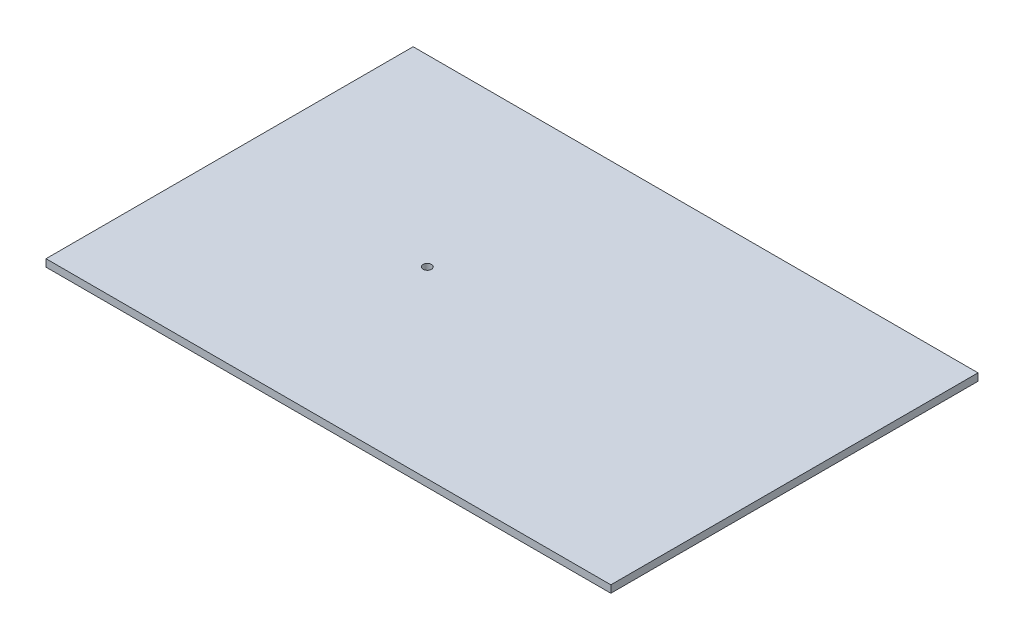
ISO-10303-21;
HEADER;
FILE_DESCRIPTION(('STEP AP214'),'2;1');
FILE_NAME('part.step','',(''),(''),'','','');
FILE_SCHEMA(('AUTOMOTIVE_DESIGN { 1 0 10303 214 1 1 1 1 }'));
ENDSEC;
DATA;
#1=APPLICATION_CONTEXT('core data for automotive mechanical design processes');
#2=APPLICATION_PROTOCOL_DEFINITION('international standard','automotive_design',2000,#1);
#3=PRODUCT_CONTEXT('',#1,'mechanical');
#4=PRODUCT('Part','Part','',(#3));
#5=PRODUCT_RELATED_PRODUCT_CATEGORY('part','',(#4));
#6=PRODUCT_DEFINITION_FORMATION('','',#4);
#7=PRODUCT_DEFINITION_CONTEXT('part definition',#1,'design');
#8=PRODUCT_DEFINITION('design','',#6,#7);
#9=PRODUCT_DEFINITION_SHAPE('','',#8);
#10=(LENGTH_UNIT() NAMED_UNIT(*) SI_UNIT(.MILLI.,.METRE.));
#11=(NAMED_UNIT(*) PLANE_ANGLE_UNIT() SI_UNIT($,.RADIAN.));
#12=(NAMED_UNIT(*) SI_UNIT($,.STERADIAN.) SOLID_ANGLE_UNIT());
#13=UNCERTAINTY_MEASURE_WITH_UNIT(LENGTH_MEASURE(1.E-05),#10,'distance_accuracy_value','');
#14=(GEOMETRIC_REPRESENTATION_CONTEXT(3) GLOBAL_UNCERTAINTY_ASSIGNED_CONTEXT((#13)) GLOBAL_UNIT_ASSIGNED_CONTEXT((#10,
#11,#12)) REPRESENTATION_CONTEXT('',''));
#15=CARTESIAN_POINT('',(0.,0.,0.));
#16=DIRECTION('',(0.,0.,1.));
#17=DIRECTION('',(1.,0.,0.));
#18=AXIS2_PLACEMENT_3D('',#15,#16,#17);
#19=CARTESIAN_POINT('',(0.,3.302,-82.55));
#20=DIRECTION('',(0.,0.,-1.));
#21=DIRECTION('',(-1.,0.,0.));
#22=AXIS2_PLACEMENT_3D('',#19,#20,#21);
#23=PLANE('',#22);
#24=DIRECTION('',(1.,0.,0.));
#25=VECTOR('',#24,1.);
#26=CARTESIAN_POINT('',(0.,0.,-82.55));
#27=LINE('',#26,#25);
#28=CARTESIAN_POINT('',(-127.,0.,-82.55));
#29=VERTEX_POINT('',#28);
#30=CARTESIAN_POINT('',(127.,0.,-82.55));
#31=VERTEX_POINT('',#30);
#32=EDGE_CURVE('E125',#29,#31,#27,.T.);
#33=ORIENTED_EDGE('',*,*,#32,.F.);
#34=DIRECTION('',(0.,-1.,0.));
#35=VECTOR('',#34,1.);
#36=CARTESIAN_POINT('',(-127.,3.302,-82.55));
#37=LINE('',#36,#35);
#38=CARTESIAN_POINT('',(-127.,3.302,-82.55));
#39=VERTEX_POINT('',#38);
#40=EDGE_CURVE('E11',#39,#29,#37,.T.);
#41=ORIENTED_EDGE('',*,*,#40,.F.);
#42=DIRECTION('',(1.,0.,0.));
#43=VECTOR('',#42,1.);
#44=CARTESIAN_POINT('',(0.,3.302,-82.55));
#45=LINE('',#44,#43);
#46=CARTESIAN_POINT('',(127.,3.302,-82.55));
#47=VERTEX_POINT('',#46);
#48=EDGE_CURVE('E111',#39,#47,#45,.T.);
#49=ORIENTED_EDGE('',*,*,#48,.T.);
#50=DIRECTION('',(0.,-1.,0.));
#51=VECTOR('',#50,1.);
#52=CARTESIAN_POINT('',(127.,3.302,-82.55));
#53=LINE('',#52,#51);
#54=EDGE_CURVE('E88',#47,#31,#53,.T.);
#55=ORIENTED_EDGE('',*,*,#54,.T.);
#56=EDGE_LOOP('',(#33,#41,#49,#55));
#57=FACE_BOUND('',#56,.T.);
#58=ADVANCED_FACE('F47',(#57),#23,.T.);
#59=CARTESIAN_POINT('',(-127.,3.302,0.));
#60=DIRECTION('',(-1.,0.,0.));
#61=DIRECTION('',(0.,0.,1.));
#62=AXIS2_PLACEMENT_3D('',#59,#60,#61);
#63=PLANE('',#62);
#64=DIRECTION('',(0.,0.,-1.));
#65=VECTOR('',#64,1.);
#66=CARTESIAN_POINT('',(-127.,0.,0.));
#67=LINE('',#66,#65);
#68=CARTESIAN_POINT('',(-127.,0.,82.55));
#69=VERTEX_POINT('',#68);
#70=EDGE_CURVE('E100',#69,#29,#67,.T.);
#71=ORIENTED_EDGE('',*,*,#70,.F.);
#72=DIRECTION('',(0.,-1.,0.));
#73=VECTOR('',#72,1.);
#74=CARTESIAN_POINT('',(-127.,3.302,82.55));
#75=LINE('',#74,#73);
#76=CARTESIAN_POINT('',(-127.,3.302,82.55));
#77=VERTEX_POINT('',#76);
#78=EDGE_CURVE('E57',#77,#69,#75,.T.);
#79=ORIENTED_EDGE('',*,*,#78,.F.);
#80=DIRECTION('',(0.,0.,-1.));
#81=VECTOR('',#80,1.);
#82=CARTESIAN_POINT('',(-127.,3.302,0.));
#83=LINE('',#82,#81);
#84=EDGE_CURVE('E98',#77,#39,#83,.T.);
#85=ORIENTED_EDGE('',*,*,#84,.T.);
#86=ORIENTED_EDGE('',*,*,#40,.T.);
#87=EDGE_LOOP('',(#71,#79,#85,#86));
#88=FACE_BOUND('',#87,.T.);
#89=ADVANCED_FACE('F96',(#88),#63,.T.);
#90=CARTESIAN_POINT('',(0.,3.302,82.55));
#91=DIRECTION('',(0.,0.,-1.));
#92=DIRECTION('',(-1.,0.,0.));
#93=AXIS2_PLACEMENT_3D('',#90,#91,#92);
#94=PLANE('',#93);
#95=DIRECTION('',(1.,0.,0.));
#96=VECTOR('',#95,1.);
#97=CARTESIAN_POINT('',(0.,0.,82.55));
#98=LINE('',#97,#96);
#99=CARTESIAN_POINT('',(127.,0.,82.55));
#100=VERTEX_POINT('',#99);
#101=EDGE_CURVE('E130',#69,#100,#98,.T.);
#102=ORIENTED_EDGE('',*,*,#101,.T.);
#103=DIRECTION('',(0.,-1.,0.));
#104=VECTOR('',#103,1.);
#105=CARTESIAN_POINT('',(127.,3.302,82.55));
#106=LINE('',#105,#104);
#107=CARTESIAN_POINT('',(127.,3.302,82.55));
#108=VERTEX_POINT('',#107);
#109=EDGE_CURVE('E104',#108,#100,#106,.T.);
#110=ORIENTED_EDGE('',*,*,#109,.F.);
#111=DIRECTION('',(1.,0.,0.));
#112=VECTOR('',#111,1.);
#113=CARTESIAN_POINT('',(0.,3.302,82.55));
#114=LINE('',#113,#112);
#115=EDGE_CURVE('E106',#77,#108,#114,.T.);
#116=ORIENTED_EDGE('',*,*,#115,.F.);
#117=ORIENTED_EDGE('',*,*,#78,.T.);
#118=EDGE_LOOP('',(#102,#110,#116,#117));
#119=FACE_BOUND('',#118,.T.);
#120=ADVANCED_FACE('F107',(#119),#94,.F.);
#121=CARTESIAN_POINT('',(-38.1,3.302,0.));
#122=DIRECTION('',(0.,-1.,0.));
#123=DIRECTION('',(0.,0.,-1.));
#124=AXIS2_PLACEMENT_3D('',#121,#122,#123);
#125=CYLINDRICAL_SURFACE('',#124,1.905);
#126=CARTESIAN_POINT('',(-38.1,3.302,0.));
#127=DIRECTION('',(0.,1.,0.));
#128=DIRECTION('',(0.,0.,1.));
#129=AXIS2_PLACEMENT_3D('',#126,#127,#128);
#130=CIRCLE('',#129,1.905);
#131=CARTESIAN_POINT('',(-38.1,3.302,-1.90499999999999));
#132=VERTEX_POINT('',#131);
#133=EDGE_CURVE('E115',#132,#132,#130,.T.);
#134=CARTESIAN_POINT('',(-38.1,0.,0.));
#135=DIRECTION('',(0.,1.,0.));
#136=DIRECTION('',(0.,0.,1.));
#137=AXIS2_PLACEMENT_3D('',#134,#135,#136);
#138=CIRCLE('',#137,1.905);
#139=CARTESIAN_POINT('',(-38.1,0.,-1.90499999999999));
#140=VERTEX_POINT('',#139);
#141=EDGE_CURVE('E121',#140,#140,#138,.T.);
#142=CARTESIAN_POINT('',(-38.1,3.302,-1.90499999999999));
#143=CARTESIAN_POINT('',(-38.1,3.26760416666667,-1.90499999999999));
#144=CARTESIAN_POINT('',(-38.1,3.23320833333333,-1.90499999999999));
#145=CARTESIAN_POINT('',(-38.1,3.16441666666667,-1.90499999999999));
#146=CARTESIAN_POINT('',(-38.1,3.13002083333333,-1.90499999999999));
#147=CARTESIAN_POINT('',(-38.1,3.06122916666667,-1.90499999999999));
#148=CARTESIAN_POINT('',(-38.1,3.02683333333333,-1.90499999999999));
#149=CARTESIAN_POINT('',(-38.1,2.95804166666667,-1.90499999999999));
#150=CARTESIAN_POINT('',(-38.1,2.92364583333333,-1.90499999999999));
#151=CARTESIAN_POINT('',(-38.1,2.85485416666667,-1.90499999999999));
#152=CARTESIAN_POINT('',(-38.1,2.82045833333333,-1.90499999999999));
#153=CARTESIAN_POINT('',(-38.1,2.75166666666667,-1.90499999999999));
#154=CARTESIAN_POINT('',(-38.1,2.71727083333333,-1.90499999999999));
#155=CARTESIAN_POINT('',(-38.1,2.64847916666667,-1.90499999999999));
#156=CARTESIAN_POINT('',(-38.1,2.61408333333333,-1.90499999999999));
#157=CARTESIAN_POINT('',(-38.1,2.54529166666667,-1.90499999999999));
#158=CARTESIAN_POINT('',(-38.1,2.51089583333333,-1.90499999999999));
#159=CARTESIAN_POINT('',(-38.1,2.44210416666667,-1.90499999999999));
#160=CARTESIAN_POINT('',(-38.1,2.40770833333333,-1.90499999999999));
#161=CARTESIAN_POINT('',(-38.1,2.33891666666667,-1.90499999999999));
#162=CARTESIAN_POINT('',(-38.1,2.30452083333333,-1.90499999999999));
#163=CARTESIAN_POINT('',(-38.1,2.23572916666667,-1.90499999999999));
#164=CARTESIAN_POINT('',(-38.1,2.20133333333333,-1.90499999999999));
#165=CARTESIAN_POINT('',(-38.1,2.13254166666667,-1.90499999999999));
#166=CARTESIAN_POINT('',(-38.1,2.09814583333333,-1.90499999999999));
#167=CARTESIAN_POINT('',(-38.1,2.02935416666667,-1.90499999999999));
#168=CARTESIAN_POINT('',(-38.1,1.99495833333333,-1.90499999999999));
#169=CARTESIAN_POINT('',(-38.1,1.92616666666667,-1.90499999999999));
#170=CARTESIAN_POINT('',(-38.1,1.89177083333333,-1.90499999999999));
#171=CARTESIAN_POINT('',(-38.1,1.82297916666667,-1.90499999999999));
#172=CARTESIAN_POINT('',(-38.1,1.78858333333333,-1.90499999999999));
#173=CARTESIAN_POINT('',(-38.1,1.71979166666667,-1.90499999999999));
#174=CARTESIAN_POINT('',(-38.1,1.68539583333333,-1.90499999999999));
#175=CARTESIAN_POINT('',(-38.1,1.61660416666667,-1.90499999999999));
#176=CARTESIAN_POINT('',(-38.1,1.58220833333333,-1.90499999999999));
#177=CARTESIAN_POINT('',(-38.1,1.51341666666667,-1.90499999999999));
#178=CARTESIAN_POINT('',(-38.1,1.47902083333333,-1.90499999999999));
#179=CARTESIAN_POINT('',(-38.1,1.41022916666667,-1.90499999999999));
#180=CARTESIAN_POINT('',(-38.1,1.37583333333333,-1.90499999999999));
#181=CARTESIAN_POINT('',(-38.1,1.30704166666667,-1.90499999999999));
#182=CARTESIAN_POINT('',(-38.1,1.27264583333333,-1.90499999999999));
#183=CARTESIAN_POINT('',(-38.1,1.20385416666667,-1.90499999999999));
#184=CARTESIAN_POINT('',(-38.1,1.16945833333333,-1.90499999999999));
#185=CARTESIAN_POINT('',(-38.1,1.10066666666667,-1.90499999999999));
#186=CARTESIAN_POINT('',(-38.1,1.06627083333333,-1.90499999999999));
#187=CARTESIAN_POINT('',(-38.1,0.997479166666666,-1.90499999999999));
#188=CARTESIAN_POINT('',(-38.1,0.963083333333333,-1.90499999999999));
#189=CARTESIAN_POINT('',(-38.1,0.894291666666666,-1.90499999999999));
#190=CARTESIAN_POINT('',(-38.1,0.859895833333333,-1.90499999999999));
#191=CARTESIAN_POINT('',(-38.1,0.791104166666666,-1.90499999999999));
#192=CARTESIAN_POINT('',(-38.1,0.756708333333333,-1.90499999999999));
#193=CARTESIAN_POINT('',(-38.1,0.687916666666667,-1.90499999999999));
#194=CARTESIAN_POINT('',(-38.1,0.653520833333333,-1.90499999999999));
#195=CARTESIAN_POINT('',(-38.1,0.584729166666667,-1.90499999999999));
#196=CARTESIAN_POINT('',(-38.1,0.550333333333333,-1.90499999999999));
#197=CARTESIAN_POINT('',(-38.1,0.481541666666667,-1.90499999999999));
#198=CARTESIAN_POINT('',(-38.1,0.447145833333333,-1.90499999999999));
#199=CARTESIAN_POINT('',(-38.1,0.378354166666667,-1.90499999999999));
#200=CARTESIAN_POINT('',(-38.1,0.343958333333333,-1.90499999999999));
#201=CARTESIAN_POINT('',(-38.1,0.275166666666667,-1.90499999999999));
#202=CARTESIAN_POINT('',(-38.1,0.240770833333333,-1.90499999999999));
#203=CARTESIAN_POINT('',(-38.1,0.171979166666667,-1.90499999999999));
#204=CARTESIAN_POINT('',(-38.1,0.137583333333333,-1.90499999999999));
#205=CARTESIAN_POINT('',(-38.1,0.0687916666666666,-1.90499999999999));
#206=CARTESIAN_POINT('',(-38.1,0.0343958333333333,-1.90499999999999));
#207=CARTESIAN_POINT('',(-38.1,0.,-1.90499999999999));
#208=B_SPLINE_CURVE_WITH_KNOTS('',3,(#142,#143,#144,#145,#146,#147,#148,#149,#150,#151,#152,
#153,#154,#155,#156,#157,#158,#159,#160,#161,#162,#163,#164,#165,#166,#167,#168,#169,#170,#171,
#172,#173,#174,#175,#176,#177,#178,#179,#180,#181,#182,#183,#184,#185,#186,#187,#188,#189,#190,
#191,#192,#193,#194,#195,#196,#197,#198,#199,#200,#201,#202,#203,#204,#205,#206,#207),
.UNSPECIFIED.,.F.,.F.,(4,2,2,2,2,2,2,2,2,2,2,2,2,2,2,2,2,2,2,2,2,2,2,2,2,2,2,2,2,2,2,2,4),(0.,
0.1031875,0.206375,0.3095625,0.41275,0.5159375,0.619125,0.7223125,0.8255,0.9286875,1.031875,
1.1350625,1.23825,1.3414375,1.444625,1.5478125,1.651,1.7541875,1.857375,1.9605625,2.06375,
2.1669375,2.270125,2.3733125,2.4765,2.5796875,2.682875,2.7860625,2.88925,2.9924375,3.095625,
3.1988125,3.302),.UNSPECIFIED.);
#209=EDGE_CURVE('BSEAM49',#132,#140,#208,.T.);
#210=ORIENTED_EDGE('',*,*,#133,.T.);
#211=ORIENTED_EDGE('',*,*,#141,.F.);
#212=ORIENTED_EDGE('',*,*,#209,.T.);
#213=ORIENTED_EDGE('',*,*,#209,.F.);
#214=EDGE_LOOP('',(#210,#212,#211,#213));
#215=FACE_BOUND('',#214,.T.);
#216=ADVANCED_FACE('F49',(#215),#125,.F.);
#217=CARTESIAN_POINT('',(127.,3.302,0.));
#218=DIRECTION('',(-1.,0.,0.));
#219=DIRECTION('',(0.,0.,1.));
#220=AXIS2_PLACEMENT_3D('',#217,#218,#219);
#221=PLANE('',#220);
#222=DIRECTION('',(0.,0.,-1.));
#223=VECTOR('',#222,1.);
#224=CARTESIAN_POINT('',(127.,0.,0.));
#225=LINE('',#224,#223);
#226=EDGE_CURVE('E81',#100,#31,#225,.T.);
#227=ORIENTED_EDGE('',*,*,#226,.T.);
#228=ORIENTED_EDGE('',*,*,#54,.F.);
#229=DIRECTION('',(0.,0.,-1.));
#230=VECTOR('',#229,1.);
#231=CARTESIAN_POINT('',(127.,3.302,0.));
#232=LINE('',#231,#230);
#233=EDGE_CURVE('E65',#108,#47,#232,.T.);
#234=ORIENTED_EDGE('',*,*,#233,.F.);
#235=ORIENTED_EDGE('',*,*,#109,.T.);
#236=EDGE_LOOP('',(#227,#228,#234,#235));
#237=FACE_BOUND('',#236,.T.);
#238=ADVANCED_FACE('F139',(#237),#221,.F.);
#239=CARTESIAN_POINT('',(0.,3.302,0.));
#240=DIRECTION('',(0.,1.,0.));
#241=DIRECTION('',(0.,0.,1.));
#242=AXIS2_PLACEMENT_3D('',#239,#240,#241);
#243=PLANE('',#242);
#244=ORIENTED_EDGE('',*,*,#133,.F.);
#245=EDGE_LOOP('',(#244));
#246=FACE_BOUND('',#245,.T.);
#247=ORIENTED_EDGE('',*,*,#48,.F.);
#248=ORIENTED_EDGE('',*,*,#84,.F.);
#249=ORIENTED_EDGE('',*,*,#115,.T.);
#250=ORIENTED_EDGE('',*,*,#233,.T.);
#251=EDGE_LOOP('',(#247,#248,#249,#250));
#252=FACE_BOUND('',#251,.T.);
#253=ADVANCED_FACE('F110',(#246,#252),#243,.T.);
#254=CARTESIAN_POINT('',(0.,0.,0.));
#255=DIRECTION('',(0.,1.,0.));
#256=DIRECTION('',(0.,0.,1.));
#257=AXIS2_PLACEMENT_3D('',#254,#255,#256);
#258=PLANE('',#257);
#259=ORIENTED_EDGE('',*,*,#141,.T.);
#260=EDGE_LOOP('',(#259));
#261=FACE_BOUND('',#260,.T.);
#262=ORIENTED_EDGE('',*,*,#32,.T.);
#263=ORIENTED_EDGE('',*,*,#226,.F.);
#264=ORIENTED_EDGE('',*,*,#101,.F.);
#265=ORIENTED_EDGE('',*,*,#70,.T.);
#266=EDGE_LOOP('',(#262,#263,#264,#265));
#267=FACE_BOUND('',#266,.T.);
#268=ADVANCED_FACE('F140',(#261,#267),#258,.F.);
#269=CLOSED_SHELL('',(#58,#89,#120,#216,#238,#253,#268));
#270=MANIFOLD_SOLID_BREP('B2',#269);
#271=ADVANCED_BREP_SHAPE_REPRESENTATION('',(#18,#270),#14);
#272=SHAPE_DEFINITION_REPRESENTATION(#9,#271);
ENDSEC;
END-ISO-10303-21;
